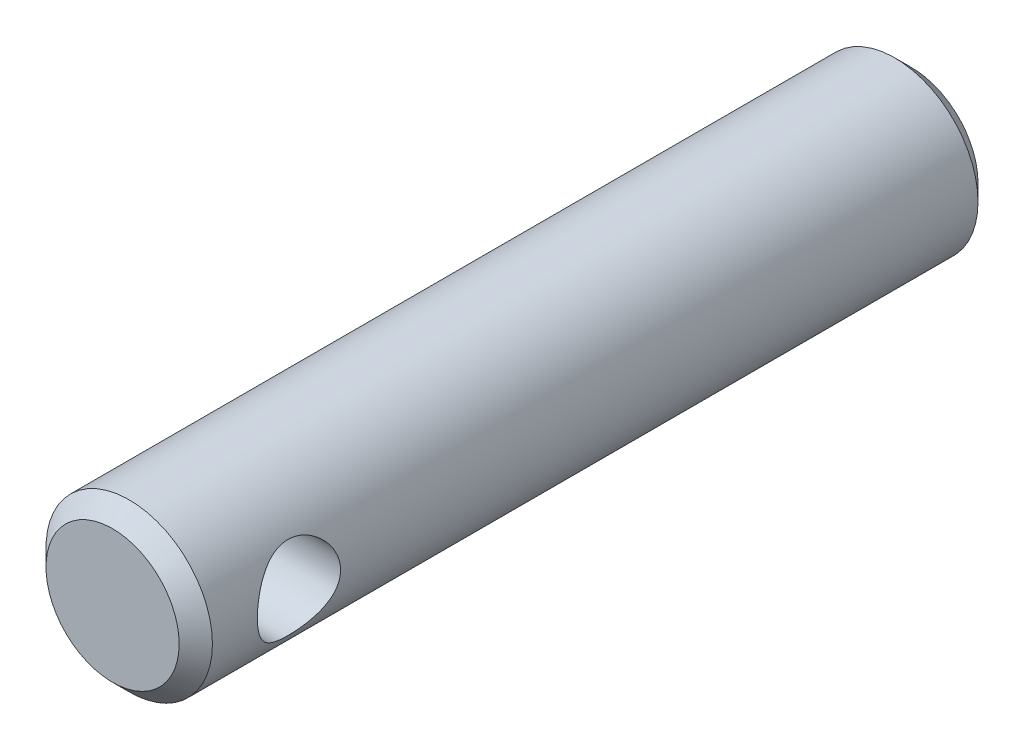
ISO-10303-21;
HEADER;
FILE_DESCRIPTION(('STEP AP214'),'2;1');
FILE_NAME('part.step','',(''),(''),'','','');
FILE_SCHEMA(('AUTOMOTIVE_DESIGN { 1 0 10303 214 1 1 1 1 }'));
ENDSEC;
DATA;
#1=APPLICATION_CONTEXT('core data for automotive mechanical design processes');
#2=APPLICATION_PROTOCOL_DEFINITION('international standard','automotive_design',2000,#1);
#3=PRODUCT_CONTEXT('',#1,'mechanical');
#4=PRODUCT('Part','Part','',(#3));
#5=PRODUCT_RELATED_PRODUCT_CATEGORY('part','',(#4));
#6=PRODUCT_DEFINITION_FORMATION('','',#4);
#7=PRODUCT_DEFINITION_CONTEXT('part definition',#1,'design');
#8=PRODUCT_DEFINITION('design','',#6,#7);
#9=PRODUCT_DEFINITION_SHAPE('','',#8);
#10=(LENGTH_UNIT() NAMED_UNIT(*) SI_UNIT(.MILLI.,.METRE.));
#11=(NAMED_UNIT(*) PLANE_ANGLE_UNIT() SI_UNIT($,.RADIAN.));
#12=(NAMED_UNIT(*) SI_UNIT($,.STERADIAN.) SOLID_ANGLE_UNIT());
#13=UNCERTAINTY_MEASURE_WITH_UNIT(LENGTH_MEASURE(1.E-05),#10,'distance_accuracy_value','');
#14=(GEOMETRIC_REPRESENTATION_CONTEXT(3) GLOBAL_UNCERTAINTY_ASSIGNED_CONTEXT((#13)) GLOBAL_UNIT_ASSIGNED_CONTEXT((#10,
#11,#12)) REPRESENTATION_CONTEXT('',''));
#15=CARTESIAN_POINT('',(0.,0.,0.));
#16=DIRECTION('',(0.,0.,1.));
#17=DIRECTION('',(1.,0.,0.));
#18=AXIS2_PLACEMENT_3D('',#15,#16,#17);
#19=CARTESIAN_POINT('',(0.,0.,24.));
#20=DIRECTION('',(0.,0.,-1.));
#21=DIRECTION('',(-1.,0.,0.));
#22=AXIS2_PLACEMENT_3D('',#19,#20,#21);
#23=CYLINDRICAL_SURFACE('',#22,5.);
#24=CARTESIAN_POINT('',(-5.,0.,15.3));
#25=CARTESIAN_POINT('',(-4.99999177550472,0.131426682334305,15.300009669056));
#26=CARTESIAN_POINT('',(-4.99476199135277,0.263015634437212,15.310425561774));
#27=CARTESIAN_POINT('',(-4.9743541856102,0.522301454622882,15.351631821162));
#28=CARTESIAN_POINT('',(-4.9591572718767,0.649990448564104,15.382460880925));
#29=CARTESIAN_POINT('',(-4.92040690922477,0.897333631316202,15.4629846227188));
#30=CARTESIAN_POINT('',(-4.89688595907259,1.01701694536277,15.5126059877827));
#31=CARTESIAN_POINT('',(-4.84364443325827,1.24618160399671,15.6289265262518));
#32=CARTESIAN_POINT('',(-4.81392434644421,1.3556637520377,15.6956243531451));
#33=CARTESIAN_POINT('',(-4.74890645050632,1.56876952630998,15.8487931316426));
#34=CARTESIAN_POINT('',(-4.71337997659091,1.67163802294308,15.9362162002298));
#35=CARTESIAN_POINT('',(-4.64149925776731,1.86194861703332,16.1263036959853));
#36=CARTESIAN_POINT('',(-4.60514440566897,1.94937895911555,16.2289796288401));
#37=CARTESIAN_POINT('',(-4.53247377945622,2.11312999967247,16.4562083744453));
#38=CARTESIAN_POINT('',(-4.49637967412567,2.18806333849064,16.581840246035));
#39=CARTESIAN_POINT('',(-4.43214946943555,2.31542056761491,16.8459183397954));
#40=CARTESIAN_POINT('',(-4.40400769020792,2.36786053751682,16.9843553217626));
#41=CARTESIAN_POINT('',(-4.36144667591402,2.44533110537653,17.2616627635964));
#42=CARTESIAN_POINT('',(-4.34630678958452,2.47181464267578,17.4000111301796));
#43=CARTESIAN_POINT('',(-4.3295472487215,2.50106748329741,17.6799470944376));
#44=CARTESIAN_POINT('',(-4.3279142335843,2.50386022093906,17.8215313521751));
#45=CARTESIAN_POINT('',(-4.33777325642937,2.48671821792512,18.0857150607909));
#46=CARTESIAN_POINT('',(-4.34771909154984,2.46946139884055,18.2085600780583));
#47=CARTESIAN_POINT('',(-4.37690571834675,2.41734962264384,18.4493047734319));
#48=CARTESIAN_POINT('',(-4.39614947079454,2.38248905974454,18.5672028632631));
#49=CARTESIAN_POINT('',(-4.44218691031839,2.29552445096459,18.7980728314143));
#50=CARTESIAN_POINT('',(-4.46914601659993,2.24303766778987,18.9108659969645));
#51=CARTESIAN_POINT('',(-4.52758510703513,2.12260421917012,19.126585731475));
#52=CARTESIAN_POINT('',(-4.55906711950477,2.0546506095312,19.2295078390002));
#53=CARTESIAN_POINT('',(-4.62782894758213,1.89516513728194,19.4363031318581));
#54=CARTESIAN_POINT('',(-4.66533775591865,1.8017361459232,19.5386421839404));
#55=CARTESIAN_POINT('',(-4.73869058251018,1.59888894685345,19.7268385464772));
#56=CARTESIAN_POINT('',(-4.77453379897003,1.48946314143572,19.8126879800847));
#57=CARTESIAN_POINT('',(-4.84254968207409,1.25129126457962,19.9692141525743));
#58=CARTESIAN_POINT('',(-4.87447460405015,1.12188397899853,20.0390011811143));
#59=CARTESIAN_POINT('',(-4.92894702803108,0.851165538721986,20.1552425726075));
#60=CARTESIAN_POINT('',(-4.95150197358893,0.709863940663163,20.2017154625379));
#61=CARTESIAN_POINT('',(-4.98310834353579,0.431916229151781,20.2661885092917));
#62=CARTESIAN_POINT('',(-4.9931234575324,0.295853826370907,20.286228089367));
#63=CARTESIAN_POINT('',(-5.00182533647794,0.0219489998732895,20.3036618278362));
#64=CARTESIAN_POINT('',(-5.00051746803426,-0.115892549675108,20.3010667140985));
#65=CARTESIAN_POINT('',(-4.98727980633468,-0.378082429964655,20.2744832789533));
#66=CARTESIAN_POINT('',(-4.97618114219992,-0.502648520123706,20.2521686681756));
#67=CARTESIAN_POINT('',(-4.94555428287529,-0.746017230755971,20.1894048202616));
#68=CARTESIAN_POINT('',(-4.92602515837625,-0.864819214231883,20.1489535838641));
#69=CARTESIAN_POINT('',(-4.87960628532329,-1.09722152111965,20.0500038339196));
#70=CARTESIAN_POINT('',(-4.85252204417873,-1.21057599249831,19.9910223747177));
#71=CARTESIAN_POINT('',(-4.7935993579975,-1.42615340426439,19.8572311608752));
#72=CARTESIAN_POINT('',(-4.76175888940534,-1.52837157450203,19.7824146634801));
#73=CARTESIAN_POINT('',(-4.69270553315086,-1.72941922315487,19.6105989367091));
#74=CARTESIAN_POINT('',(-4.65527212009488,-1.82693019428496,19.5121428290248));
#75=CARTESIAN_POINT('',(-4.58155978921587,-2.0046408025722,19.3001871219505));
#76=CARTESIAN_POINT('',(-4.54528168472407,-2.08482846428685,19.1866772029301));
#77=CARTESIAN_POINT('',(-4.4762798054528,-2.22926978618994,18.9408908645153));
#78=CARTESIAN_POINT('',(-4.44381323981254,-2.29256373922243,18.8079718347089));
#79=CARTESIAN_POINT('',(-4.38935180726746,-2.39520706511459,18.5312248311174));
#80=CARTESIAN_POINT('',(-4.36734345549014,-2.43458729077055,18.387411184));
#81=CARTESIAN_POINT('',(-4.33903752569351,-2.48465421767005,18.107724442637));
#82=CARTESIAN_POINT('',(-4.33143458674096,-2.4977324874436,17.972414365881));
#83=CARTESIAN_POINT('',(-4.32913386592579,-2.50172288950898,17.7013823326193));
#84=CARTESIAN_POINT('',(-4.3344304902511,-2.49264462983266,17.5656605801264));
#85=CARTESIAN_POINT('',(-4.35594655164663,-2.45481530197331,17.3112912443831));
#86=CARTESIAN_POINT('',(-4.37107736338133,-2.42802074302696,17.1922488182792));
#87=CARTESIAN_POINT('',(-4.40927540337602,-2.35793843840544,16.9604797078));
#88=CARTESIAN_POINT('',(-4.43234518434965,-2.31464538728732,16.8477550684335));
#89=CARTESIAN_POINT('',(-4.48571326433412,-2.20953919315538,16.6234378472803));
#90=CARTESIAN_POINT('',(-4.5163930799845,-2.14667719009403,16.512430148265));
#91=CARTESIAN_POINT('',(-4.58088327077455,-2.00537808387989,16.3018137567599));
#92=CARTESIAN_POINT('',(-4.61469526970767,-1.92693287765888,16.2022110373713));
#93=CARTESIAN_POINT('',(-4.6865581632701,-1.74550556946065,16.0046446362504));
#94=CARTESIAN_POINT('',(-4.7246249151498,-1.6407002246921,15.9083506358286));
#95=CARTESIAN_POINT('',(-4.79694347383545,-1.41539785420684,15.7343441505719));
#96=CARTESIAN_POINT('',(-4.83119321905446,-1.29489242426332,15.6566416813941));
#97=CARTESIAN_POINT('',(-4.89245149457782,-1.03978808878536,15.5219030205159));
#98=CARTESIAN_POINT('',(-4.91940711437488,-0.905095560782287,15.4650168322155));
#99=CARTESIAN_POINT('',(-4.9517796092335,-0.696328709257351,15.3978161412076));
#100=CARTESIAN_POINT('',(-4.96122314081874,-0.625670413494089,15.3784446019982));
#101=CARTESIAN_POINT('',(-4.97717127275101,-0.482623997839258,15.3459340516294));
#102=CARTESIAN_POINT('',(-4.98367766823159,-0.410236963092402,15.3327912333236));
#103=CARTESIAN_POINT('',(-4.9923820076613,-0.28151868462167,15.3152625277154));
#104=CARTESIAN_POINT('',(-4.99523288466454,-0.225408499555444,15.3095450634687));
#105=CARTESIAN_POINT('',(-4.99904367329658,-0.112875528456288,15.3019116705343));
#106=CARTESIAN_POINT('',(-5.00000353273198,-0.0564527338382177,15.2999958467745));
#107=CARTESIAN_POINT('',(-5.,0.,15.3));
#108=B_SPLINE_CURVE_WITH_KNOTS('',3,(#24,#25,#26,#27,#28,#29,#30,#31,#32,#33,#34,#35,#36,#37,
#38,#39,#40,#41,#42,#43,#44,#45,#46,#47,#48,#49,#50,#51,#52,#53,#54,#55,#56,#57,#58,#59,#60,#61,
#62,#63,#64,#65,#66,#67,#68,#69,#70,#71,#72,#73,#74,#75,#76,#77,#78,#79,#80,#81,#82,#83,#84,#85,
#86,#87,#88,#89,#90,#91,#92,#93,#94,#95,#96,#97,#98,#99,#100,#101,#102,#103,#104,#105,#106,
#107),.UNSPECIFIED.,.T.,.F.,(4,2,2,2,2,2,2,2,2,2,2,2,2,2,2,2,2,2,2,2,2,2,2,2,2,2,2,2,2,2,2,2,2,
2,2,2,2,2,2,2,2,4),(0.,0.394060643550731,0.788870374272994,1.18215538873074,1.57540940145392,
1.99245439679522,2.40981559413509,2.85954316076881,3.30894869745702,3.73145030350574,
4.15353393322551,4.52514281023301,4.89687009814196,5.27725600421218,5.65781303150554,
6.08662353334695,6.51563836496715,6.96457555536101,7.41315542280699,7.82458226178364,
8.2358141127869,8.61517266265305,8.99457304077328,9.38482140069746,9.77523626870848,
10.2039902661037,10.6330397153795,11.0828670540368,11.53211279863,11.9382326875698,
12.3441764966106,12.7114482562151,13.0788382197025,13.4709114195009,13.8631890285845,
14.303131068923,14.7433095845248,15.1866003415819,15.407934939208,15.6291340766843,
15.7983933645035,15.9676573239323),.UNSPECIFIED.);
#109=CARTESIAN_POINT('',(-5.,0.,15.3));
#110=VERTEX_POINT('',#109);
#111=EDGE_CURVE('E10',#110,#110,#108,.T.);
#112=ORIENTED_EDGE('',*,*,#111,.T.);
#113=EDGE_LOOP('',(#112));
#114=FACE_BOUND('',#113,.T.);
#115=CARTESIAN_POINT('',(5.,0.,20.3));
#116=CARTESIAN_POINT('',(4.99999177550472,0.131426682334305,20.299990330944));
#117=CARTESIAN_POINT('',(4.99476199135277,0.263015634437213,20.289574438226));
#118=CARTESIAN_POINT('',(4.9743541856102,0.522301454622883,20.2483681788379));
#119=CARTESIAN_POINT('',(4.9591572718767,0.649990448564105,20.217539119075));
#120=CARTESIAN_POINT('',(4.92040690922477,0.897333631316203,20.1370153772811));
#121=CARTESIAN_POINT('',(4.89688595907259,1.01701694536277,20.0873940122173));
#122=CARTESIAN_POINT('',(4.84364443325827,1.24618160399671,19.9710734737482));
#123=CARTESIAN_POINT('',(4.81392434644421,1.3556637520377,19.9043756468549));
#124=CARTESIAN_POINT('',(4.74890645050632,1.56876952630998,19.7512068683574));
#125=CARTESIAN_POINT('',(4.71337997659091,1.67163802294308,19.6637837997702));
#126=CARTESIAN_POINT('',(4.64149925776731,1.86194861703332,19.4736963040147));
#127=CARTESIAN_POINT('',(4.60514440566897,1.94937895911555,19.3710203711599));
#128=CARTESIAN_POINT('',(4.53247377945622,2.11312999967247,19.1437916255547));
#129=CARTESIAN_POINT('',(4.49637967412567,2.18806333849064,19.018159753965));
#130=CARTESIAN_POINT('',(4.43214946943555,2.31542056761491,18.7540816602046));
#131=CARTESIAN_POINT('',(4.40400769020792,2.36786053751682,18.6156446782374));
#132=CARTESIAN_POINT('',(4.36144667591402,2.44533110537653,18.3383372364036));
#133=CARTESIAN_POINT('',(4.34630678958452,2.47181464267578,18.1999888698204));
#134=CARTESIAN_POINT('',(4.3295472487215,2.50106748329741,17.9200529055624));
#135=CARTESIAN_POINT('',(4.3279142335843,2.50386022093906,17.7784686478249));
#136=CARTESIAN_POINT('',(4.33777325642937,2.48671821792512,17.5142849392091));
#137=CARTESIAN_POINT('',(4.34771909154984,2.46946139884055,17.3914399219417));
#138=CARTESIAN_POINT('',(4.37690571834675,2.41734962264384,17.1506952265681));
#139=CARTESIAN_POINT('',(4.39614947079454,2.38248905974454,17.0327971367369));
#140=CARTESIAN_POINT('',(4.44218691031839,2.29552445096459,16.8019271685857));
#141=CARTESIAN_POINT('',(4.46914601659993,2.24303766778987,16.6891340030355));
#142=CARTESIAN_POINT('',(4.52758510703513,2.12260421917012,16.473414268525));
#143=CARTESIAN_POINT('',(4.55906711950477,2.0546506095312,16.3704921609998));
#144=CARTESIAN_POINT('',(4.62782894758213,1.89516513728194,16.1636968681419));
#145=CARTESIAN_POINT('',(4.66533775591865,1.8017361459232,16.0613578160596));
#146=CARTESIAN_POINT('',(4.73869058251018,1.59888894685344,15.8731614535227));
#147=CARTESIAN_POINT('',(4.77453379897003,1.48946314143572,15.7873120199153));
#148=CARTESIAN_POINT('',(4.84254968207409,1.25129126457962,15.6307858474257));
#149=CARTESIAN_POINT('',(4.87447460405015,1.12188397899853,15.5609988188856));
#150=CARTESIAN_POINT('',(4.92894702803108,0.851165538721986,15.4447574273925));
#151=CARTESIAN_POINT('',(4.95150197358893,0.709863940663163,15.3982845374621));
#152=CARTESIAN_POINT('',(4.98310834353579,0.431916229151781,15.3338114907083));
#153=CARTESIAN_POINT('',(4.9931234575324,0.295853826370906,15.313771910633));
#154=CARTESIAN_POINT('',(5.00182533647794,0.0219489998732892,15.2963381721638));
#155=CARTESIAN_POINT('',(5.00051746803426,-0.115892549675108,15.2989332859015));
#156=CARTESIAN_POINT('',(4.98727980633468,-0.378082429964654,15.3255167210467));
#157=CARTESIAN_POINT('',(4.97618114219992,-0.502648520123704,15.3478313318244));
#158=CARTESIAN_POINT('',(4.94555428287529,-0.74601723075597,15.4105951797384));
#159=CARTESIAN_POINT('',(4.92602515837625,-0.864819214231882,15.4510464161359));
#160=CARTESIAN_POINT('',(4.87960628532329,-1.09722152111965,15.5499961660804));
#161=CARTESIAN_POINT('',(4.85252204417873,-1.21057599249831,15.6089776252823));
#162=CARTESIAN_POINT('',(4.7935993579975,-1.42615340426439,15.7427688391248));
#163=CARTESIAN_POINT('',(4.76175888940534,-1.52837157450203,15.8175853365199));
#164=CARTESIAN_POINT('',(4.69270553315087,-1.72941922315487,15.9894010632909));
#165=CARTESIAN_POINT('',(4.65527212009488,-1.82693019428496,16.0878571709752));
#166=CARTESIAN_POINT('',(4.58155978921587,-2.0046408025722,16.2998128780494));
#167=CARTESIAN_POINT('',(4.54528168472407,-2.08482846428685,16.4133227970699));
#168=CARTESIAN_POINT('',(4.4762798054528,-2.22926978618994,16.6591091354846));
#169=CARTESIAN_POINT('',(4.44381323981254,-2.29256373922243,16.7920281652911));
#170=CARTESIAN_POINT('',(4.38935180726746,-2.39520706511459,17.0687751688825));
#171=CARTESIAN_POINT('',(4.36734345549014,-2.43458729077055,17.212588816));
#172=CARTESIAN_POINT('',(4.33903752569351,-2.48465421767005,17.4922755573629));
#173=CARTESIAN_POINT('',(4.33143458674096,-2.4977324874436,17.627585634119));
#174=CARTESIAN_POINT('',(4.32913386592579,-2.50172288950898,17.8986176673807));
#175=CARTESIAN_POINT('',(4.3344304902511,-2.49264462983266,18.0343394198736));
#176=CARTESIAN_POINT('',(4.35594655164663,-2.45481530197332,18.2887087556168));
#177=CARTESIAN_POINT('',(4.37107736338133,-2.42802074302696,18.4077511817207));
#178=CARTESIAN_POINT('',(4.40927540337602,-2.35793843840544,18.6395202921999));
#179=CARTESIAN_POINT('',(4.43234518434965,-2.31464538728732,18.7522449315665));
#180=CARTESIAN_POINT('',(4.48571326433412,-2.20953919315538,18.9765621527197));
#181=CARTESIAN_POINT('',(4.5163930799845,-2.14667719009403,19.087569851735));
#182=CARTESIAN_POINT('',(4.58088327077455,-2.0053780838799,19.29818624324));
#183=CARTESIAN_POINT('',(4.61469526970766,-1.92693287765888,19.3977889626287));
#184=CARTESIAN_POINT('',(4.6865581632701,-1.74550556946065,19.5953553637496));
#185=CARTESIAN_POINT('',(4.7246249151498,-1.6407002246921,19.6916493641714));
#186=CARTESIAN_POINT('',(4.79694347383545,-1.41539785420684,19.865655849428));
#187=CARTESIAN_POINT('',(4.83119321905446,-1.29489242426332,19.9433583186059));
#188=CARTESIAN_POINT('',(4.89245149457782,-1.03978808878537,20.0780969794841));
#189=CARTESIAN_POINT('',(4.91940711437488,-0.90509556078229,20.1349831677844));
#190=CARTESIAN_POINT('',(4.9517796092335,-0.696328709257354,20.2021838587924));
#191=CARTESIAN_POINT('',(4.96122314081874,-0.62567041349409,20.2215553980018));
#192=CARTESIAN_POINT('',(4.97717127275101,-0.48262399783926,20.2540659483706));
#193=CARTESIAN_POINT('',(4.98367766823159,-0.410236963092404,20.2672087666763));
#194=CARTESIAN_POINT('',(4.9923820076613,-0.281518684621673,20.2847374722846));
#195=CARTESIAN_POINT('',(4.99523288466454,-0.225408499555445,20.2904549365313));
#196=CARTESIAN_POINT('',(4.99904367329658,-0.112875528456289,20.2980883294657));
#197=CARTESIAN_POINT('',(5.00000353273198,-0.0564527338382179,20.3000041532255));
#198=CARTESIAN_POINT('',(5.,0.,20.3));
#199=B_SPLINE_CURVE_WITH_KNOTS('',3,(#115,#116,#117,#118,#119,#120,#121,#122,#123,#124,#125,
#126,#127,#128,#129,#130,#131,#132,#133,#134,#135,#136,#137,#138,#139,#140,#141,#142,#143,#144,
#145,#146,#147,#148,#149,#150,#151,#152,#153,#154,#155,#156,#157,#158,#159,#160,#161,#162,#163,
#164,#165,#166,#167,#168,#169,#170,#171,#172,#173,#174,#175,#176,#177,#178,#179,#180,#181,#182,
#183,#184,#185,#186,#187,#188,#189,#190,#191,#192,#193,#194,#195,#196,#197,#198),.UNSPECIFIED.,
.T.,.F.,(4,2,2,2,2,2,2,2,2,2,2,2,2,2,2,2,2,2,2,2,2,2,2,2,2,2,2,2,2,2,2,2,2,2,2,2,2,2,2,2,2,4),
(0.,0.394060643550731,0.788870374272993,1.18215538873075,1.57540940145392,1.99245439679522,
2.40981559413509,2.85954316076881,3.30894869745702,3.73145030350574,4.15353393322551,
4.52514281023301,4.89687009814196,5.27725600421218,5.65781303150554,6.08662353334696,
6.51563836496715,6.96457555536101,7.41315542280699,7.82458226178364,8.2358141127869,
8.61517266265304,8.99457304077328,9.38482140069746,9.77523626870848,10.2039902661037,
10.6330397153795,11.0828670540368,11.53211279863,11.9382326875698,12.3441764966106,
12.7114482562151,13.0788382197025,13.4709114195009,13.8631890285845,14.303131068923,
14.7433095845248,15.1866003415818,15.407934939208,15.6291340766843,15.7983933645035,
15.9676573239323),.UNSPECIFIED.);
#200=CARTESIAN_POINT('',(5.,0.,20.3));
#201=VERTEX_POINT('',#200);
#202=EDGE_CURVE('E48',#201,#201,#199,.T.);
#203=ORIENTED_EDGE('',*,*,#202,.T.);
#204=EDGE_LOOP('',(#203));
#205=FACE_BOUND('',#204,.T.);
#206=CARTESIAN_POINT('',(0.,0.,-23.));
#207=DIRECTION('',(0.,0.,1.));
#208=DIRECTION('',(1.,0.,0.));
#209=AXIS2_PLACEMENT_3D('',#206,#207,#208);
#210=CIRCLE('',#209,5.);
#211=CARTESIAN_POINT('',(5.,0.,-23.));
#212=VERTEX_POINT('',#211);
#213=EDGE_CURVE('E90',#212,#212,#210,.T.);
#214=ORIENTED_EDGE('',*,*,#213,.T.);
#215=EDGE_LOOP('',(#214));
#216=FACE_BOUND('',#215,.T.);
#217=CARTESIAN_POINT('',(0.,0.,23.));
#218=DIRECTION('',(0.,0.,1.));
#219=DIRECTION('',(1.,0.,0.));
#220=AXIS2_PLACEMENT_3D('',#217,#218,#219);
#221=CIRCLE('',#220,5.);
#222=CARTESIAN_POINT('',(5.,0.,23.));
#223=VERTEX_POINT('',#222);
#224=EDGE_CURVE('E93',#223,#223,#221,.F.);
#225=ORIENTED_EDGE('',*,*,#224,.T.);
#226=EDGE_LOOP('',(#225));
#227=FACE_BOUND('',#226,.T.);
#228=ADVANCED_FACE('F35',(#114,#205,#216,#227),#23,.T.);
#229=CARTESIAN_POINT('',(0.,0.,24.));
#230=DIRECTION('',(0.,0.,1.));
#231=DIRECTION('',(1.,0.,0.));
#232=AXIS2_PLACEMENT_3D('',#229,#230,#231);
#233=PLANE('',#232);
#234=CARTESIAN_POINT('',(0.,0.,24.));
#235=DIRECTION('',(0.,0.,1.));
#236=DIRECTION('',(1.,0.,0.));
#237=AXIS2_PLACEMENT_3D('',#234,#235,#236);
#238=CIRCLE('',#237,4.);
#239=CARTESIAN_POINT('',(4.,0.,24.));
#240=VERTEX_POINT('',#239);
#241=EDGE_CURVE('E52',#240,#240,#238,.T.);
#242=ORIENTED_EDGE('',*,*,#241,.T.);
#243=EDGE_LOOP('',(#242));
#244=FACE_BOUND('',#243,.T.);
#245=ADVANCED_FACE('F71',(#244),#233,.T.);
#246=CARTESIAN_POINT('',(0.,0.,-24.));
#247=DIRECTION('',(0.,0.,1.));
#248=DIRECTION('',(1.,0.,0.));
#249=AXIS2_PLACEMENT_3D('',#246,#247,#248);
#250=PLANE('',#249);
#251=CARTESIAN_POINT('',(0.,0.,-24.));
#252=DIRECTION('',(0.,0.,1.));
#253=DIRECTION('',(1.,0.,0.));
#254=AXIS2_PLACEMENT_3D('',#251,#252,#253);
#255=CIRCLE('',#254,4.);
#256=CARTESIAN_POINT('',(4.,0.,-24.));
#257=VERTEX_POINT('',#256);
#258=EDGE_CURVE('E56',#257,#257,#255,.F.);
#259=ORIENTED_EDGE('',*,*,#258,.T.);
#260=EDGE_LOOP('',(#259));
#261=FACE_BOUND('',#260,.T.);
#262=ADVANCED_FACE('F73',(#261),#250,.F.);
#263=CARTESIAN_POINT('',(0.,0.,-23.));
#264=DIRECTION('',(0.,0.,1.));
#265=DIRECTION('',(1.,0.,0.));
#266=AXIS2_PLACEMENT_3D('',#263,#264,#265);
#267=CONICAL_SURFACE('',#266,5.,0.785398163397446);
#268=ORIENTED_EDGE('',*,*,#258,.F.);
#269=EDGE_LOOP('',(#268));
#270=FACE_BOUND('',#269,.T.);
#271=ORIENTED_EDGE('',*,*,#213,.F.);
#272=EDGE_LOOP('',(#271));
#273=FACE_BOUND('',#272,.T.);
#274=ADVANCED_FACE('F76',(#270,#273),#267,.T.);
#275=CARTESIAN_POINT('',(0.,0.,24.));
#276=DIRECTION('',(0.,0.,-1.));
#277=DIRECTION('',(-1.,0.,0.));
#278=AXIS2_PLACEMENT_3D('',#275,#276,#277);
#279=CONICAL_SURFACE('',#278,4.,0.785398163397446);
#280=ORIENTED_EDGE('',*,*,#224,.F.);
#281=EDGE_LOOP('',(#280));
#282=FACE_BOUND('',#281,.T.);
#283=ORIENTED_EDGE('',*,*,#241,.F.);
#284=EDGE_LOOP('',(#283));
#285=FACE_BOUND('',#284,.T.);
#286=ADVANCED_FACE('F38',(#282,#285),#279,.T.);
#287=CARTESIAN_POINT('',(0.,0.,17.8));
#288=DIRECTION('',(-1.,0.,0.));
#289=DIRECTION('',(0.,0.,1.));
#290=AXIS2_PLACEMENT_3D('',#287,#288,#289);
#291=CYLINDRICAL_SURFACE('',#290,2.5);
#292=ORIENTED_EDGE('',*,*,#202,.F.);
#293=EDGE_LOOP('',(#292));
#294=FACE_BOUND('',#293,.T.);
#295=ORIENTED_EDGE('',*,*,#111,.F.);
#296=EDGE_LOOP('',(#295));
#297=FACE_BOUND('',#296,.T.);
#298=ADVANCED_FACE('F65',(#294,#297),#291,.F.);
#299=CLOSED_SHELL('',(#228,#245,#262,#274,#286,#298));
#300=MANIFOLD_SOLID_BREP('B2',#299);
#301=ADVANCED_BREP_SHAPE_REPRESENTATION('',(#18,#300),#14);
#302=SHAPE_DEFINITION_REPRESENTATION(#9,#301);
ENDSEC;
END-ISO-10303-21;
